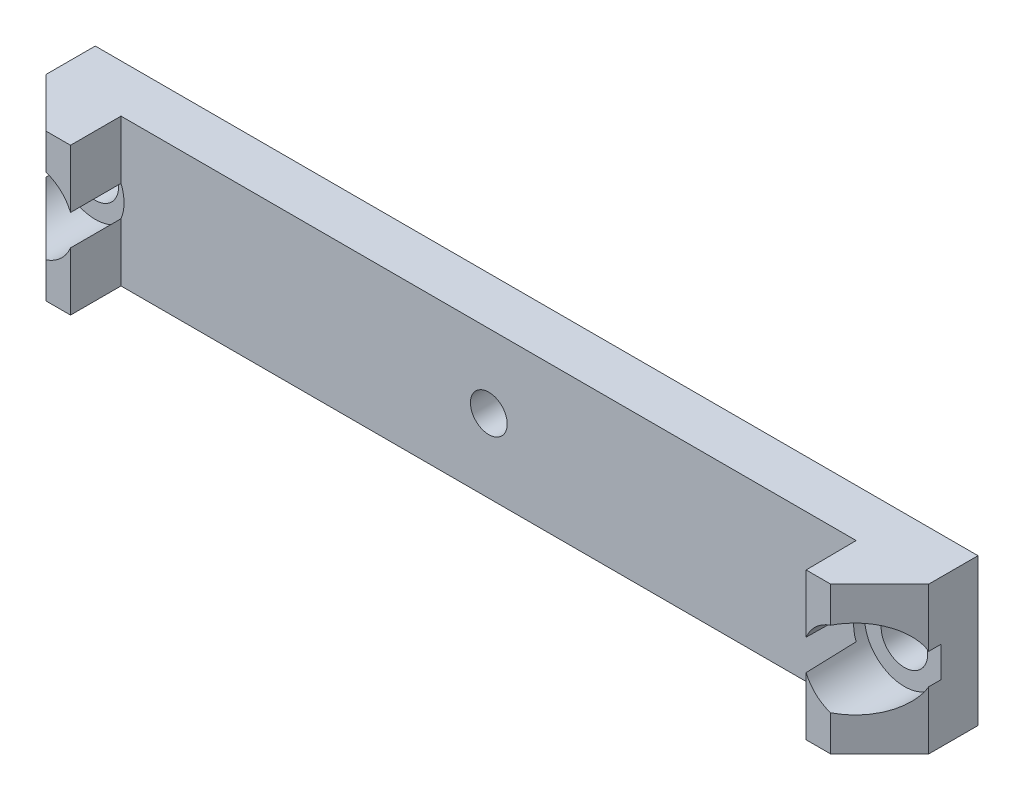
ISO-10303-21;
HEADER;
FILE_DESCRIPTION(('STEP AP214'),'2;1');
FILE_NAME('part.step','',(''),(''),'','','');
FILE_SCHEMA(('AUTOMOTIVE_DESIGN { 1 0 10303 214 1 1 1 1 }'));
ENDSEC;
DATA;
#1=APPLICATION_CONTEXT('core data for automotive mechanical design processes');
#2=APPLICATION_PROTOCOL_DEFINITION('international standard','automotive_design',2000,#1);
#3=PRODUCT_CONTEXT('',#1,'mechanical');
#4=PRODUCT('Part','Part','',(#3));
#5=PRODUCT_RELATED_PRODUCT_CATEGORY('part','',(#4));
#6=PRODUCT_DEFINITION_FORMATION('','',#4);
#7=PRODUCT_DEFINITION_CONTEXT('part definition',#1,'design');
#8=PRODUCT_DEFINITION('design','',#6,#7);
#9=PRODUCT_DEFINITION_SHAPE('','',#8);
#10=(LENGTH_UNIT() NAMED_UNIT(*) SI_UNIT(.MILLI.,.METRE.));
#11=(NAMED_UNIT(*) PLANE_ANGLE_UNIT() SI_UNIT($,.RADIAN.));
#12=(NAMED_UNIT(*) SI_UNIT($,.STERADIAN.) SOLID_ANGLE_UNIT());
#13=UNCERTAINTY_MEASURE_WITH_UNIT(LENGTH_MEASURE(1.E-05),#10,'distance_accuracy_value','');
#14=(GEOMETRIC_REPRESENTATION_CONTEXT(3) GLOBAL_UNCERTAINTY_ASSIGNED_CONTEXT((#13)) GLOBAL_UNIT_ASSIGNED_CONTEXT((#10,
#11,#12)) REPRESENTATION_CONTEXT('',''));
#15=CARTESIAN_POINT('',(0.,0.,0.));
#16=DIRECTION('',(0.,0.,1.));
#17=DIRECTION('',(1.,0.,0.));
#18=AXIS2_PLACEMENT_3D('',#15,#16,#17);
#19=CARTESIAN_POINT('',(-33.,0.,-9.19238815542512));
#20=DIRECTION('',(0.,0.,1.));
#21=DIRECTION('',(1.,0.,0.));
#22=AXIS2_PLACEMENT_3D('',#19,#20,#21);
#23=CYLINDRICAL_SURFACE('',#22,3.25);
#24=DIRECTION('',(0.,0.,-1.));
#25=VECTOR('',#24,1.);
#26=CARTESIAN_POINT('',(-30.,-1.25,4.2));
#27=LINE('',#26,#25);
#28=CARTESIAN_POINT('',(-30.,-1.25,3.9));
#29=VERTEX_POINT('',#28);
#30=CARTESIAN_POINT('',(-30.,-1.25,8.01789608293694));
#31=VERTEX_POINT('',#30);
#32=EDGE_CURVE('E203',#29,#31,#27,.F.);
#33=ORIENTED_EDGE('',*,*,#32,.F.);
#34=CARTESIAN_POINT('',(-33.,0.,3.9));
#35=DIRECTION('',(0.,0.,-1.));
#36=DIRECTION('',(-1.,0.,0.));
#37=AXIS2_PLACEMENT_3D('',#34,#35,#36);
#38=CIRCLE('',#37,3.25);
#39=CARTESIAN_POINT('',(-30.,1.25,3.9));
#40=VERTEX_POINT('',#39);
#41=EDGE_CURVE('E429',#29,#40,#38,.F.);
#42=ORIENTED_EDGE('',*,*,#41,.T.);
#43=DIRECTION('',(0.,0.,-1.));
#44=VECTOR('',#43,1.);
#45=CARTESIAN_POINT('',(-30.,1.25,4.2));
#46=LINE('',#45,#44);
#47=CARTESIAN_POINT('',(-30.,1.25,8.01789608293694));
#48=VERTEX_POINT('',#47);
#49=EDGE_CURVE('E212',#48,#40,#46,.T.);
#50=ORIENTED_EDGE('',*,*,#49,.F.);
#51=CARTESIAN_POINT('',(-33.,0.,8.01789608293694));
#52=DIRECTION('',(0.,0.,1.));
#53=DIRECTION('',(1.,0.,0.));
#54=AXIS2_PLACEMENT_3D('',#51,#52,#53);
#55=CIRCLE('',#54,3.25);
#56=CARTESIAN_POINT('',(-32.,3.09232921921324,8.01789608293694));
#57=VERTEX_POINT('',#56);
#58=EDGE_CURVE('E211',#57,#48,#55,.F.);
#59=ORIENTED_EDGE('',*,*,#58,.F.);
#60=CARTESIAN_POINT('',(-33.,0.,7.01789608293693));
#61=DIRECTION('',(-0.707106781186548,0.,0.707106781186547));
#62=DIRECTION('',(0.707106781186547,0.,0.707106781186548));
#63=AXIS2_PLACEMENT_3D('',#60,#61,#62);
#64=ELLIPSE('',#63,4.59619407771256,3.25);
#65=CARTESIAN_POINT('',(-36.,1.24999999999999,4.01789608293693));
#66=VERTEX_POINT('',#65);
#67=EDGE_CURVE('E208',#66,#57,#64,.F.);
#68=ORIENTED_EDGE('',*,*,#67,.F.);
#69=DIRECTION('',(0.,0.,1.));
#70=VECTOR('',#69,1.);
#71=CARTESIAN_POINT('',(-36.,1.24999999999999,-9.19238815542512));
#72=LINE('',#71,#70);
#73=CARTESIAN_POINT('',(-36.,1.24999999999999,3.));
#74=VERTEX_POINT('',#73);
#75=EDGE_CURVE('E336',#74,#66,#72,.T.);
#76=ORIENTED_EDGE('',*,*,#75,.F.);
#77=CARTESIAN_POINT('',(-33.,0.,3.));
#78=DIRECTION('',(0.,0.,1.));
#79=DIRECTION('',(1.,0.,0.));
#80=AXIS2_PLACEMENT_3D('',#77,#78,#79);
#81=CIRCLE('',#80,3.25);
#82=CARTESIAN_POINT('',(-36.,-1.24999999999999,3.));
#83=VERTEX_POINT('',#82);
#84=EDGE_CURVE('E204',#83,#74,#81,.T.);
#85=ORIENTED_EDGE('',*,*,#84,.F.);
#86=DIRECTION('',(0.,0.,1.));
#87=VECTOR('',#86,1.);
#88=CARTESIAN_POINT('',(-36.,-1.24999999999999,-9.19238815542512));
#89=LINE('',#88,#87);
#90=CARTESIAN_POINT('',(-36.,-1.24999999999999,4.01789608293693));
#91=VERTEX_POINT('',#90);
#92=EDGE_CURVE('E333',#91,#83,#89,.F.);
#93=ORIENTED_EDGE('',*,*,#92,.F.);
#94=CARTESIAN_POINT('',(-33.,0.,7.01789608293693));
#95=DIRECTION('',(-0.707106781186548,0.,0.707106781186547));
#96=DIRECTION('',(0.707106781186547,0.,0.707106781186548));
#97=AXIS2_PLACEMENT_3D('',#94,#95,#96);
#98=ELLIPSE('',#97,4.59619407771256,3.25);
#99=CARTESIAN_POINT('',(-32.,-3.09232921921324,8.01789608293694));
#100=VERTEX_POINT('',#99);
#101=EDGE_CURVE('E190',#100,#91,#98,.F.);
#102=ORIENTED_EDGE('',*,*,#101,.F.);
#103=CARTESIAN_POINT('',(-33.,0.,8.01789608293694));
#104=DIRECTION('',(0.,0.,1.));
#105=DIRECTION('',(1.,0.,0.));
#106=AXIS2_PLACEMENT_3D('',#103,#104,#105);
#107=CIRCLE('',#106,3.25);
#108=EDGE_CURVE('E201',#31,#100,#107,.F.);
#109=ORIENTED_EDGE('',*,*,#108,.F.);
#110=EDGE_LOOP('',(#33,#42,#50,#59,#68,#76,#85,#93,#102,#109));
#111=FACE_BOUND('',#110,.T.);
#112=ADVANCED_FACE('F42',(#111),#23,.F.);
#113=CARTESIAN_POINT('',(33.,0.,-9.19238815542512));
#114=DIRECTION('',(0.,0.,1.));
#115=DIRECTION('',(1.,0.,0.));
#116=AXIS2_PLACEMENT_3D('',#113,#114,#115);
#117=CYLINDRICAL_SURFACE('',#116,3.25);
#118=CARTESIAN_POINT('',(29.9636318165585,1.15886507177674,4.2));
#119=CARTESIAN_POINT('',(29.9811279470011,1.20470707280253,6.03672654397552));
#120=CARTESIAN_POINT('',(30.,1.25000000000003,8.01789608293694));
#121=B_SPLINE_CURVE_WITH_KNOTS('',2,(#118,#119,#120),.UNSPECIFIED.,.F.,.F.,(3,3),(0.,1.),.UNSPECIFIED.);
#122=CARTESIAN_POINT('',(29.9636318165585,1.15886507177675,4.2));
#123=VERTEX_POINT('',#122);
#124=CARTESIAN_POINT('',(30.,1.25000000000004,8.01789608293694));
#125=VERTEX_POINT('',#124);
#126=EDGE_CURVE('E171',#123,#125,#121,.T.);
#127=ORIENTED_EDGE('',*,*,#126,.F.);
#128=DIRECTION('',(0.,0.,1.));
#129=VECTOR('',#128,1.);
#130=CARTESIAN_POINT('',(29.9636318165585,1.15886507177675,-9.19238815542512));
#131=LINE('',#130,#129);
#132=CARTESIAN_POINT('',(29.9636318165585,1.15886507177675,3.9));
#133=VERTEX_POINT('',#132);
#134=EDGE_CURVE('E342',#123,#133,#131,.F.);
#135=ORIENTED_EDGE('',*,*,#134,.T.);
#136=CARTESIAN_POINT('',(33.,0.,3.9));
#137=DIRECTION('',(0.,0.,-1.));
#138=DIRECTION('',(-1.,0.,0.));
#139=AXIS2_PLACEMENT_3D('',#136,#137,#138);
#140=CIRCLE('',#139,3.25);
#141=CARTESIAN_POINT('',(29.9636318165585,-1.15886507177675,3.9));
#142=VERTEX_POINT('',#141);
#143=EDGE_CURVE('E434',#133,#142,#140,.F.);
#144=ORIENTED_EDGE('',*,*,#143,.T.);
#145=DIRECTION('',(0.,0.,1.));
#146=VECTOR('',#145,1.);
#147=CARTESIAN_POINT('',(29.9636318165585,-1.15886507177675,-9.19238815542512));
#148=LINE('',#147,#146);
#149=CARTESIAN_POINT('',(29.9636318165585,-1.15886507177674,4.19999999999964));
#150=VERTEX_POINT('',#149);
#151=EDGE_CURVE('E428',#142,#150,#148,.T.);
#152=ORIENTED_EDGE('',*,*,#151,.T.);
#153=CARTESIAN_POINT('',(30.,-1.25000000000003,8.01789608293694));
#154=CARTESIAN_POINT('',(29.9811279470011,-1.20470707280254,6.03672654397578));
#155=CARTESIAN_POINT('',(29.9636318165585,-1.15886507177674,4.2));
#156=B_SPLINE_CURVE_WITH_KNOTS('',2,(#153,#154,#155),.UNSPECIFIED.,.F.,.F.,(3,3),(0.,1.),.UNSPECIFIED.);
#157=CARTESIAN_POINT('',(30.,-1.25000000000004,8.01789608293694));
#158=VERTEX_POINT('',#157);
#159=EDGE_CURVE('E265',#158,#150,#156,.T.);
#160=ORIENTED_EDGE('',*,*,#159,.F.);
#161=CARTESIAN_POINT('',(33.,0.,8.01789608293694));
#162=DIRECTION('',(0.,0.,1.));
#163=DIRECTION('',(1.,0.,0.));
#164=AXIS2_PLACEMENT_3D('',#161,#162,#163);
#165=CIRCLE('',#164,3.25);
#166=CARTESIAN_POINT('',(32.,-3.09232921921325,8.01789608293694));
#167=VERTEX_POINT('',#166);
#168=EDGE_CURVE('E198',#167,#158,#165,.F.);
#169=ORIENTED_EDGE('',*,*,#168,.F.);
#170=CARTESIAN_POINT('',(33.,0.,7.01789608293695));
#171=DIRECTION('',(0.707106781186545,0.,0.70710678118655));
#172=DIRECTION('',(-0.70710678118655,0.,0.707106781186545));
#173=AXIS2_PLACEMENT_3D('',#170,#171,#172);
#174=ELLIPSE('',#173,4.59619407771255,3.25);
#175=CARTESIAN_POINT('',(36.,-1.24999999999999,4.01789608293696));
#176=VERTEX_POINT('',#175);
#177=EDGE_CURVE('E182',#176,#167,#174,.F.);
#178=ORIENTED_EDGE('',*,*,#177,.F.);
#179=DIRECTION('',(0.,0.,1.));
#180=VECTOR('',#179,1.);
#181=CARTESIAN_POINT('',(36.,-1.24999999999999,-9.19238815542512));
#182=LINE('',#181,#180);
#183=CARTESIAN_POINT('',(36.,-1.24999999999999,3.));
#184=VERTEX_POINT('',#183);
#185=EDGE_CURVE('E172',#184,#176,#182,.T.);
#186=ORIENTED_EDGE('',*,*,#185,.F.);
#187=CARTESIAN_POINT('',(33.,0.,3.));
#188=DIRECTION('',(0.,0.,1.));
#189=DIRECTION('',(1.,0.,0.));
#190=AXIS2_PLACEMENT_3D('',#187,#188,#189);
#191=CIRCLE('',#190,3.25);
#192=CARTESIAN_POINT('',(36.,1.24999999999999,3.));
#193=VERTEX_POINT('',#192);
#194=EDGE_CURVE('E358',#193,#184,#191,.T.);
#195=ORIENTED_EDGE('',*,*,#194,.F.);
#196=DIRECTION('',(0.,0.,1.));
#197=VECTOR('',#196,1.);
#198=CARTESIAN_POINT('',(36.,1.24999999999999,-9.19238815542512));
#199=LINE('',#198,#197);
#200=CARTESIAN_POINT('',(36.,1.24999999999999,4.01789608293696));
#201=VERTEX_POINT('',#200);
#202=EDGE_CURVE('E186',#201,#193,#199,.F.);
#203=ORIENTED_EDGE('',*,*,#202,.F.);
#204=CARTESIAN_POINT('',(33.,0.,7.01789608293695));
#205=DIRECTION('',(0.707106781186545,0.,0.70710678118655));
#206=DIRECTION('',(-0.70710678118655,0.,0.707106781186545));
#207=AXIS2_PLACEMENT_3D('',#204,#205,#206);
#208=ELLIPSE('',#207,4.59619407771255,3.25);
#209=CARTESIAN_POINT('',(32.,3.09232921921325,8.01789608293694));
#210=VERTEX_POINT('',#209);
#211=EDGE_CURVE('E179',#210,#201,#208,.F.);
#212=ORIENTED_EDGE('',*,*,#211,.F.);
#213=CARTESIAN_POINT('',(33.,0.,8.01789608293694));
#214=DIRECTION('',(0.,0.,1.));
#215=DIRECTION('',(1.,0.,0.));
#216=AXIS2_PLACEMENT_3D('',#213,#214,#215);
#217=CIRCLE('',#216,3.25);
#218=EDGE_CURVE('E161',#125,#210,#217,.F.);
#219=ORIENTED_EDGE('',*,*,#218,.F.);
#220=EDGE_LOOP('',(#127,#135,#144,#152,#160,#169,#178,#186,#195,#203,#212,#219));
#221=FACE_BOUND('',#220,.T.);
#222=ADVANCED_FACE('F184',(#221),#117,.F.);
#223=CARTESIAN_POINT('',(30.,12.9891874063228,8.01789608293694));
#224=DIRECTION('',(0.,0.,1.));
#225=DIRECTION('',(1.,0.,0.));
#226=AXIS2_PLACEMENT_3D('',#223,#224,#225);
#227=PLANE('',#226);
#228=DIRECTION('',(1.,0.,0.));
#229=VECTOR('',#228,1.);
#230=CARTESIAN_POINT('',(-36.,6.,8.01789608293694));
#231=LINE('',#230,#229);
#232=CARTESIAN_POINT('',(32.,6.,8.01789608293694));
#233=VERTEX_POINT('',#232);
#234=CARTESIAN_POINT('',(30.,6.,8.01789608293694));
#235=VERTEX_POINT('',#234);
#236=EDGE_CURVE('E245',#233,#235,#231,.F.);
#237=ORIENTED_EDGE('',*,*,#236,.T.);
#238=DIRECTION('',(0.,1.,0.));
#239=VECTOR('',#238,1.);
#240=CARTESIAN_POINT('',(30.,12.9891874063228,8.01789608293694));
#241=LINE('',#240,#239);
#242=EDGE_CURVE('E167',#125,#235,#241,.T.);
#243=ORIENTED_EDGE('',*,*,#242,.F.);
#244=ORIENTED_EDGE('',*,*,#218,.T.);
#245=DIRECTION('',(0.,1.,0.));
#246=VECTOR('',#245,1.);
#247=CARTESIAN_POINT('',(32.,12.9891874063228,8.01789608293694));
#248=LINE('',#247,#246);
#249=EDGE_CURVE('E165',#233,#210,#248,.F.);
#250=ORIENTED_EDGE('',*,*,#249,.F.);
#251=EDGE_LOOP('',(#237,#243,#244,#250));
#252=FACE_BOUND('',#251,.T.);
#253=ADVANCED_FACE('F164',(#252),#227,.T.);
#254=CARTESIAN_POINT('',(29.9636318165585,12.9891874063228,4.2));
#255=DIRECTION('',(-0.999954633480566,0.,0.00952528113747001));
#256=DIRECTION('',(0.00952528113747001,0.,0.999954633480566));
#257=AXIS2_PLACEMENT_3D('',#254,#255,#256);
#258=PLANE('',#257);
#259=DIRECTION('',(-0.00952528113747001,0.,-0.999954633480565));
#260=VECTOR('',#259,1.);
#261=CARTESIAN_POINT('',(30.,6.,8.01789608293694));
#262=LINE('',#261,#260);
#263=CARTESIAN_POINT('',(29.9636318165585,6.,4.2));
#264=VERTEX_POINT('',#263);
#265=EDGE_CURVE('E328',#235,#264,#262,.T.);
#266=ORIENTED_EDGE('',*,*,#265,.T.);
#267=DIRECTION('',(0.,1.,0.));
#268=VECTOR('',#267,1.);
#269=CARTESIAN_POINT('',(29.9636318165585,0.,4.2));
#270=LINE('',#269,#268);
#271=EDGE_CURVE('E270',#123,#264,#270,.T.);
#272=ORIENTED_EDGE('',*,*,#271,.F.);
#273=ORIENTED_EDGE('',*,*,#126,.T.);
#274=ORIENTED_EDGE('',*,*,#242,.T.);
#275=EDGE_LOOP('',(#266,#272,#273,#274));
#276=FACE_BOUND('',#275,.T.);
#277=ADVANCED_FACE('F307',(#276),#258,.T.);
#278=CARTESIAN_POINT('',(-30.,12.9891874063228,4.2));
#279=DIRECTION('',(1.,0.,0.));
#280=DIRECTION('',(0.,0.,-1.));
#281=AXIS2_PLACEMENT_3D('',#278,#279,#280);
#282=PLANE('',#281);
#283=DIRECTION('',(0.,0.,-1.));
#284=VECTOR('',#283,1.);
#285=CARTESIAN_POINT('',(-30.,6.,4.2));
#286=LINE('',#285,#284);
#287=CARTESIAN_POINT('',(-30.,6.,3.9));
#288=VERTEX_POINT('',#287);
#289=CARTESIAN_POINT('',(-30.,6.,8.01789608293694));
#290=VERTEX_POINT('',#289);
#291=EDGE_CURVE('E398',#288,#290,#286,.F.);
#292=ORIENTED_EDGE('',*,*,#291,.T.);
#293=DIRECTION('',(0.,1.,0.));
#294=VECTOR('',#293,1.);
#295=CARTESIAN_POINT('',(-30.,12.9891874063228,8.01789608293694));
#296=LINE('',#295,#294);
#297=EDGE_CURVE('E210',#48,#290,#296,.T.);
#298=ORIENTED_EDGE('',*,*,#297,.F.);
#299=ORIENTED_EDGE('',*,*,#49,.T.);
#300=DIRECTION('',(0.,-1.,0.));
#301=VECTOR('',#300,1.);
#302=CARTESIAN_POINT('',(-30.,6.00010307764066,3.9));
#303=LINE('',#302,#301);
#304=EDGE_CURVE('E474',#288,#40,#303,.T.);
#305=ORIENTED_EDGE('',*,*,#304,.F.);
#306=EDGE_LOOP('',(#292,#298,#299,#305));
#307=FACE_BOUND('',#306,.T.);
#308=ADVANCED_FACE('F303',(#307),#282,.T.);
#309=CARTESIAN_POINT('',(-30.,12.9891874063228,8.01789608293694));
#310=DIRECTION('',(0.,0.,1.));
#311=DIRECTION('',(1.,0.,0.));
#312=AXIS2_PLACEMENT_3D('',#309,#310,#311);
#313=PLANE('',#312);
#314=DIRECTION('',(1.,0.,0.));
#315=VECTOR('',#314,1.);
#316=CARTESIAN_POINT('',(-36.,6.,8.01789608293694));
#317=LINE('',#316,#315);
#318=CARTESIAN_POINT('',(-32.,6.,8.01789608293694));
#319=VERTEX_POINT('',#318);
#320=EDGE_CURVE('E394',#290,#319,#317,.F.);
#321=ORIENTED_EDGE('',*,*,#320,.T.);
#322=DIRECTION('',(0.,1.,0.));
#323=VECTOR('',#322,1.);
#324=CARTESIAN_POINT('',(-32.,12.9891874063228,8.01789608293694));
#325=LINE('',#324,#323);
#326=EDGE_CURVE('E207',#57,#319,#325,.T.);
#327=ORIENTED_EDGE('',*,*,#326,.F.);
#328=ORIENTED_EDGE('',*,*,#58,.T.);
#329=ORIENTED_EDGE('',*,*,#297,.T.);
#330=EDGE_LOOP('',(#321,#327,#328,#329));
#331=FACE_BOUND('',#330,.T.);
#332=ADVANCED_FACE('F299',(#331),#313,.T.);
#333=CARTESIAN_POINT('',(-32.,12.9891874063228,8.01789608293694));
#334=DIRECTION('',(-0.707106781186548,0.,0.707106781186547));
#335=DIRECTION('',(0.707106781186547,0.,0.707106781186548));
#336=AXIS2_PLACEMENT_3D('',#333,#334,#335);
#337=PLANE('',#336);
#338=DIRECTION('',(-0.707106781186547,0.,-0.707106781186548));
#339=VECTOR('',#338,1.);
#340=CARTESIAN_POINT('',(-32.,6.,8.01789608293694));
#341=LINE('',#340,#339);
#342=CARTESIAN_POINT('',(-36.,6.,4.01789608293692));
#343=VERTEX_POINT('',#342);
#344=EDGE_CURVE('E397',#319,#343,#341,.T.);
#345=ORIENTED_EDGE('',*,*,#344,.T.);
#346=DIRECTION('',(0.,1.,0.));
#347=VECTOR('',#346,1.);
#348=CARTESIAN_POINT('',(-36.,6.,4.01789608293692));
#349=LINE('',#348,#347);
#350=EDGE_CURVE('E554',#343,#66,#349,.F.);
#351=ORIENTED_EDGE('',*,*,#350,.T.);
#352=ORIENTED_EDGE('',*,*,#67,.T.);
#353=ORIENTED_EDGE('',*,*,#326,.T.);
#354=EDGE_LOOP('',(#345,#351,#352,#353));
#355=FACE_BOUND('',#354,.T.);
#356=ADVANCED_FACE('F295',(#355),#337,.T.);
#357=CARTESIAN_POINT('',(0.,0.,3.));
#358=DIRECTION('',(0.,0.,1.));
#359=DIRECTION('',(1.,0.,0.));
#360=AXIS2_PLACEMENT_3D('',#357,#358,#359);
#361=PLANE('',#360);
#362=DIRECTION('',(0.,1.,0.));
#363=VECTOR('',#362,1.);
#364=CARTESIAN_POINT('',(-36.,6.,3.));
#365=LINE('',#364,#363);
#366=EDGE_CURVE('E544',#74,#83,#365,.F.);
#367=ORIENTED_EDGE('',*,*,#366,.T.);
#368=ORIENTED_EDGE('',*,*,#84,.T.);
#369=EDGE_LOOP('',(#367,#368));
#370=FACE_BOUND('',#369,.T.);
#371=CARTESIAN_POINT('',(-33.,0.,3.));
#372=DIRECTION('',(0.,0.,1.));
#373=DIRECTION('',(1.,0.,0.));
#374=AXIS2_PLACEMENT_3D('',#371,#372,#373);
#375=CIRCLE('',#374,1.9);
#376=CARTESIAN_POINT('',(-31.1,0.,3.));
#377=VERTEX_POINT('',#376);
#378=EDGE_CURVE('E356',#377,#377,#375,.F.);
#379=ORIENTED_EDGE('',*,*,#378,.T.);
#380=EDGE_LOOP('',(#379));
#381=FACE_BOUND('',#380,.T.);
#382=ADVANCED_FACE('F291',(#370,#381),#361,.T.);
#383=CARTESIAN_POINT('',(-30.,12.9891874063228,8.01789608293694));
#384=DIRECTION('',(0.,0.,1.));
#385=DIRECTION('',(1.,0.,0.));
#386=AXIS2_PLACEMENT_3D('',#383,#384,#385);
#387=PLANE('',#386);
#388=DIRECTION('',(1.,0.,0.));
#389=VECTOR('',#388,1.);
#390=CARTESIAN_POINT('',(-36.,-6.,8.01789608293694));
#391=LINE('',#390,#389);
#392=CARTESIAN_POINT('',(-32.,-6.,8.01789608293694));
#393=VERTEX_POINT('',#392);
#394=CARTESIAN_POINT('',(-30.,-6.,8.01789608293694));
#395=VERTEX_POINT('',#394);
#396=EDGE_CURVE('E542',#393,#395,#391,.T.);
#397=ORIENTED_EDGE('',*,*,#396,.T.);
#398=DIRECTION('',(0.,1.,0.));
#399=VECTOR('',#398,1.);
#400=CARTESIAN_POINT('',(-30.,12.9891874063228,8.01789608293694));
#401=LINE('',#400,#399);
#402=EDGE_CURVE('E340',#31,#395,#401,.F.);
#403=ORIENTED_EDGE('',*,*,#402,.F.);
#404=ORIENTED_EDGE('',*,*,#108,.T.);
#405=DIRECTION('',(0.,1.,0.));
#406=VECTOR('',#405,1.);
#407=CARTESIAN_POINT('',(-32.,12.9891874063228,8.01789608293694));
#408=LINE('',#407,#406);
#409=EDGE_CURVE('E187',#393,#100,#408,.T.);
#410=ORIENTED_EDGE('',*,*,#409,.F.);
#411=EDGE_LOOP('',(#397,#403,#404,#410));
#412=FACE_BOUND('',#411,.T.);
#413=ADVANCED_FACE('F288',(#412),#387,.T.);
#414=CARTESIAN_POINT('',(-30.,12.9891874063228,4.2));
#415=DIRECTION('',(1.,0.,0.));
#416=DIRECTION('',(0.,0.,-1.));
#417=AXIS2_PLACEMENT_3D('',#414,#415,#416);
#418=PLANE('',#417);
#419=DIRECTION('',(0.,0.,1.));
#420=VECTOR('',#419,1.);
#421=CARTESIAN_POINT('',(-30.,-6.,4.2));
#422=LINE('',#421,#420);
#423=CARTESIAN_POINT('',(-30.,-6.,3.9));
#424=VERTEX_POINT('',#423);
#425=EDGE_CURVE('E57',#395,#424,#422,.F.);
#426=ORIENTED_EDGE('',*,*,#425,.T.);
#427=EDGE_CURVE('E477',#29,#424,#303,.T.);
#428=ORIENTED_EDGE('',*,*,#427,.F.);
#429=ORIENTED_EDGE('',*,*,#32,.T.);
#430=ORIENTED_EDGE('',*,*,#402,.T.);
#431=EDGE_LOOP('',(#426,#428,#429,#430));
#432=FACE_BOUND('',#431,.T.);
#433=ADVANCED_FACE('F283',(#432),#418,.T.);
#434=CARTESIAN_POINT('',(29.9636318165585,12.9891874063228,4.2));
#435=DIRECTION('',(-0.999954633480566,0.,0.00952528113747001));
#436=DIRECTION('',(0.00952528113747001,0.,0.999954633480566));
#437=AXIS2_PLACEMENT_3D('',#434,#435,#436);
#438=PLANE('',#437);
#439=DIRECTION('',(0.00952528113747001,0.,0.999954633480565));
#440=VECTOR('',#439,1.);
#441=CARTESIAN_POINT('',(29.9636318165585,-6.,4.2));
#442=LINE('',#441,#440);
#443=CARTESIAN_POINT('',(29.9636318165585,-6.,4.2));
#444=VERTEX_POINT('',#443);
#445=CARTESIAN_POINT('',(30.,-6.,8.01789608293694));
#446=VERTEX_POINT('',#445);
#447=EDGE_CURVE('E255',#444,#446,#442,.T.);
#448=ORIENTED_EDGE('',*,*,#447,.T.);
#449=DIRECTION('',(0.,1.,0.));
#450=VECTOR('',#449,1.);
#451=CARTESIAN_POINT('',(30.,12.9891874063228,8.01789608293694));
#452=LINE('',#451,#450);
#453=EDGE_CURVE('E197',#158,#446,#452,.F.);
#454=ORIENTED_EDGE('',*,*,#453,.F.);
#455=ORIENTED_EDGE('',*,*,#159,.T.);
#456=DIRECTION('',(0.,1.,0.));
#457=VECTOR('',#456,1.);
#458=CARTESIAN_POINT('',(29.9636318165585,12.9891874063228,4.2));
#459=LINE('',#458,#457);
#460=EDGE_CURVE('E200',#150,#444,#459,.F.);
#461=ORIENTED_EDGE('',*,*,#460,.T.);
#462=EDGE_LOOP('',(#448,#454,#455,#461));
#463=FACE_BOUND('',#462,.T.);
#464=ADVANCED_FACE('F272',(#463),#438,.T.);
#465=CARTESIAN_POINT('',(30.,12.9891874063228,8.01789608293694));
#466=DIRECTION('',(0.,0.,1.));
#467=DIRECTION('',(1.,0.,0.));
#468=AXIS2_PLACEMENT_3D('',#465,#466,#467);
#469=PLANE('',#468);
#470=DIRECTION('',(1.,0.,0.));
#471=VECTOR('',#470,1.);
#472=CARTESIAN_POINT('',(-36.,-6.,8.01789608293694));
#473=LINE('',#472,#471);
#474=CARTESIAN_POINT('',(32.,-6.,8.01789608293695));
#475=VERTEX_POINT('',#474);
#476=EDGE_CURVE('E251',#446,#475,#473,.T.);
#477=ORIENTED_EDGE('',*,*,#476,.T.);
#478=DIRECTION('',(0.,1.,0.));
#479=VECTOR('',#478,1.);
#480=CARTESIAN_POINT('',(32.,12.9891874063228,8.01789608293694));
#481=LINE('',#480,#479);
#482=EDGE_CURVE('E360',#167,#475,#481,.F.);
#483=ORIENTED_EDGE('',*,*,#482,.F.);
#484=ORIENTED_EDGE('',*,*,#168,.T.);
#485=ORIENTED_EDGE('',*,*,#453,.T.);
#486=EDGE_LOOP('',(#477,#483,#484,#485));
#487=FACE_BOUND('',#486,.T.);
#488=ADVANCED_FACE('F282',(#487),#469,.T.);
#489=CARTESIAN_POINT('',(-32.,12.9891874063228,8.01789608293694));
#490=DIRECTION('',(-0.707106781186548,0.,0.707106781186547));
#491=DIRECTION('',(0.707106781186547,0.,0.707106781186548));
#492=AXIS2_PLACEMENT_3D('',#489,#490,#491);
#493=PLANE('',#492);
#494=DIRECTION('',(0.707106781186547,0.,0.707106781186548));
#495=VECTOR('',#494,1.);
#496=CARTESIAN_POINT('',(-36.,-6.,4.01789608293692));
#497=LINE('',#496,#495);
#498=CARTESIAN_POINT('',(-36.,-6.,4.01789608293692));
#499=VERTEX_POINT('',#498);
#500=EDGE_CURVE('E237',#499,#393,#497,.T.);
#501=ORIENTED_EDGE('',*,*,#500,.T.);
#502=ORIENTED_EDGE('',*,*,#409,.T.);
#503=ORIENTED_EDGE('',*,*,#101,.T.);
#504=DIRECTION('',(0.,1.,0.));
#505=VECTOR('',#504,1.);
#506=CARTESIAN_POINT('',(-36.,6.,4.01789608293692));
#507=LINE('',#506,#505);
#508=EDGE_CURVE('E540',#91,#499,#507,.F.);
#509=ORIENTED_EDGE('',*,*,#508,.T.);
#510=EDGE_LOOP('',(#501,#502,#503,#509));
#511=FACE_BOUND('',#510,.T.);
#512=ADVANCED_FACE('F531',(#511),#493,.T.);
#513=CARTESIAN_POINT('',(32.,12.9891874063228,8.01789608293694));
#514=DIRECTION('',(0.707106781186545,0.,0.70710678118655));
#515=DIRECTION('',(0.70710678118655,0.,-0.707106781186545));
#516=AXIS2_PLACEMENT_3D('',#513,#514,#515);
#517=PLANE('',#516);
#518=DIRECTION('',(-0.707106781186551,0.,0.707106781186544));
#519=VECTOR('',#518,1.);
#520=CARTESIAN_POINT('',(36.,6.,4.01789608293696));
#521=LINE('',#520,#519);
#522=CARTESIAN_POINT('',(36.,6.,4.01789608293696));
#523=VERTEX_POINT('',#522);
#524=EDGE_CURVE('E181',#523,#233,#521,.T.);
#525=ORIENTED_EDGE('',*,*,#524,.T.);
#526=ORIENTED_EDGE('',*,*,#249,.T.);
#527=ORIENTED_EDGE('',*,*,#211,.T.);
#528=DIRECTION('',(0.,1.,0.));
#529=VECTOR('',#528,1.);
#530=CARTESIAN_POINT('',(36.,6.,4.01789608293696));
#531=LINE('',#530,#529);
#532=EDGE_CURVE('E234',#201,#523,#531,.T.);
#533=ORIENTED_EDGE('',*,*,#532,.T.);
#534=EDGE_LOOP('',(#525,#526,#527,#533));
#535=FACE_BOUND('',#534,.T.);
#536=ADVANCED_FACE('F177',(#535),#517,.T.);
#537=CARTESIAN_POINT('',(32.,12.9891874063228,8.01789608293694));
#538=DIRECTION('',(0.707106781186545,0.,0.70710678118655));
#539=DIRECTION('',(0.70710678118655,0.,-0.707106781186545));
#540=AXIS2_PLACEMENT_3D('',#537,#538,#539);
#541=PLANE('',#540);
#542=DIRECTION('',(0.707106781186551,0.,-0.707106781186544));
#543=VECTOR('',#542,1.);
#544=CARTESIAN_POINT('',(32.,-6.,8.01789608293694));
#545=LINE('',#544,#543);
#546=CARTESIAN_POINT('',(36.,-6.,4.01789608293696));
#547=VERTEX_POINT('',#546);
#548=EDGE_CURVE('E254',#475,#547,#545,.T.);
#549=ORIENTED_EDGE('',*,*,#548,.T.);
#550=DIRECTION('',(0.,1.,0.));
#551=VECTOR('',#550,1.);
#552=CARTESIAN_POINT('',(36.,6.,4.01789608293696));
#553=LINE('',#552,#551);
#554=EDGE_CURVE('E373',#547,#176,#553,.T.);
#555=ORIENTED_EDGE('',*,*,#554,.T.);
#556=ORIENTED_EDGE('',*,*,#177,.T.);
#557=ORIENTED_EDGE('',*,*,#482,.T.);
#558=EDGE_LOOP('',(#549,#555,#556,#557));
#559=FACE_BOUND('',#558,.T.);
#560=ADVANCED_FACE('F527',(#559),#541,.T.);
#561=CARTESIAN_POINT('',(0.,0.,3.));
#562=DIRECTION('',(0.,0.,1.));
#563=DIRECTION('',(1.,0.,0.));
#564=AXIS2_PLACEMENT_3D('',#561,#562,#563);
#565=PLANE('',#564);
#566=DIRECTION('',(0.,1.,0.));
#567=VECTOR('',#566,1.);
#568=CARTESIAN_POINT('',(36.,6.,3.));
#569=LINE('',#568,#567);
#570=EDGE_CURVE('E353',#184,#193,#569,.T.);
#571=ORIENTED_EDGE('',*,*,#570,.T.);
#572=ORIENTED_EDGE('',*,*,#194,.T.);
#573=EDGE_LOOP('',(#571,#572));
#574=FACE_BOUND('',#573,.T.);
#575=CARTESIAN_POINT('',(33.,0.,3.));
#576=DIRECTION('',(0.,0.,1.));
#577=DIRECTION('',(1.,0.,0.));
#578=AXIS2_PLACEMENT_3D('',#575,#576,#577);
#579=CIRCLE('',#578,1.9);
#580=CARTESIAN_POINT('',(34.9,0.,3.));
#581=VERTEX_POINT('',#580);
#582=EDGE_CURVE('E246',#581,#581,#579,.F.);
#583=ORIENTED_EDGE('',*,*,#582,.T.);
#584=EDGE_LOOP('',(#583));
#585=FACE_BOUND('',#584,.T.);
#586=ADVANCED_FACE('F524',(#574,#585),#565,.T.);
#587=CARTESIAN_POINT('',(0.,0.,0.));
#588=DIRECTION('',(0.,0.,1.));
#589=DIRECTION('',(1.,0.,0.));
#590=AXIS2_PLACEMENT_3D('',#587,#588,#589);
#591=CYLINDRICAL_SURFACE('',#590,1.5);
#592=CARTESIAN_POINT('',(0.,0.,3.9));
#593=DIRECTION('',(0.,0.,-1.));
#594=DIRECTION('',(-1.,0.,0.));
#595=AXIS2_PLACEMENT_3D('',#592,#593,#594);
#596=CIRCLE('',#595,1.5);
#597=CARTESIAN_POINT('',(-1.5,0.,3.9));
#598=VERTEX_POINT('',#597);
#599=EDGE_CURVE('E481',#598,#598,#596,.F.);
#600=ORIENTED_EDGE('',*,*,#599,.T.);
#601=EDGE_LOOP('',(#600));
#602=FACE_BOUND('',#601,.T.);
#603=CARTESIAN_POINT('',(0.,0.,0.));
#604=DIRECTION('',(0.,0.,1.));
#605=DIRECTION('',(1.,0.,0.));
#606=AXIS2_PLACEMENT_3D('',#603,#604,#605);
#607=CIRCLE('',#606,1.5);
#608=CARTESIAN_POINT('',(1.5,0.,0.));
#609=VERTEX_POINT('',#608);
#610=EDGE_CURVE('E350',#609,#609,#607,.F.);
#611=ORIENTED_EDGE('',*,*,#610,.T.);
#612=EDGE_LOOP('',(#611));
#613=FACE_BOUND('',#612,.T.);
#614=ADVANCED_FACE('F485',(#602,#613),#591,.F.);
#615=CARTESIAN_POINT('',(-33.,0.,0.));
#616=DIRECTION('',(0.,0.,1.));
#617=DIRECTION('',(1.,0.,0.));
#618=AXIS2_PLACEMENT_3D('',#615,#616,#617);
#619=CYLINDRICAL_SURFACE('',#618,1.9);
#620=CARTESIAN_POINT('',(-33.,0.,0.));
#621=DIRECTION('',(0.,0.,1.));
#622=DIRECTION('',(1.,0.,0.));
#623=AXIS2_PLACEMENT_3D('',#620,#621,#622);
#624=CIRCLE('',#623,1.9);
#625=CARTESIAN_POINT('',(-31.1,0.,0.));
#626=VERTEX_POINT('',#625);
#627=EDGE_CURVE('E347',#626,#626,#624,.F.);
#628=ORIENTED_EDGE('',*,*,#627,.T.);
#629=EDGE_LOOP('',(#628));
#630=FACE_BOUND('',#629,.T.);
#631=ORIENTED_EDGE('',*,*,#378,.F.);
#632=EDGE_LOOP('',(#631));
#633=FACE_BOUND('',#632,.T.);
#634=ADVANCED_FACE('F517',(#630,#633),#619,.F.);
#635=CARTESIAN_POINT('',(33.,0.,0.));
#636=DIRECTION('',(0.,0.,1.));
#637=DIRECTION('',(1.,0.,0.));
#638=AXIS2_PLACEMENT_3D('',#635,#636,#637);
#639=CYLINDRICAL_SURFACE('',#638,1.9);
#640=CARTESIAN_POINT('',(33.,0.,0.));
#641=DIRECTION('',(0.,0.,1.));
#642=DIRECTION('',(1.,0.,0.));
#643=AXIS2_PLACEMENT_3D('',#640,#641,#642);
#644=CIRCLE('',#643,1.9);
#645=CARTESIAN_POINT('',(34.9,0.,0.));
#646=VERTEX_POINT('',#645);
#647=EDGE_CURVE('E343',#646,#646,#644,.F.);
#648=ORIENTED_EDGE('',*,*,#647,.T.);
#649=EDGE_LOOP('',(#648));
#650=FACE_BOUND('',#649,.T.);
#651=ORIENTED_EDGE('',*,*,#582,.F.);
#652=EDGE_LOOP('',(#651));
#653=FACE_BOUND('',#652,.T.);
#654=ADVANCED_FACE('F514',(#650,#653),#639,.F.);
#655=CARTESIAN_POINT('',(-36.,6.,4.2));
#656=DIRECTION('',(0.,-1.,0.));
#657=DIRECTION('',(0.,0.,-1.));
#658=AXIS2_PLACEMENT_3D('',#655,#656,#657);
#659=PLANE('',#658);
#660=ORIENTED_EDGE('',*,*,#291,.F.);
#661=DIRECTION('',(1.,0.,0.));
#662=VECTOR('',#661,1.);
#663=CARTESIAN_POINT('',(-36.,6.,3.9));
#664=LINE('',#663,#662);
#665=CARTESIAN_POINT('',(29.9636318165585,6.,3.9));
#666=VERTEX_POINT('',#665);
#667=EDGE_CURVE('E424',#288,#666,#664,.T.);
#668=ORIENTED_EDGE('',*,*,#667,.T.);
#669=DIRECTION('',(0.,0.,1.));
#670=VECTOR('',#669,1.);
#671=CARTESIAN_POINT('',(29.9636318165585,6.,4.2));
#672=LINE('',#671,#670);
#673=EDGE_CURVE('E421',#666,#264,#672,.T.);
#674=ORIENTED_EDGE('',*,*,#673,.T.);
#675=ORIENTED_EDGE('',*,*,#265,.F.);
#676=ORIENTED_EDGE('',*,*,#236,.F.);
#677=ORIENTED_EDGE('',*,*,#524,.F.);
#678=DIRECTION('',(0.,0.,1.));
#679=VECTOR('',#678,1.);
#680=CARTESIAN_POINT('',(36.,6.,4.2));
#681=LINE('',#680,#679);
#682=CARTESIAN_POINT('',(36.,6.,0.));
#683=VERTEX_POINT('',#682);
#684=EDGE_CURVE('E236',#523,#683,#681,.F.);
#685=ORIENTED_EDGE('',*,*,#684,.T.);
#686=DIRECTION('',(1.,0.,0.));
#687=VECTOR('',#686,1.);
#688=CARTESIAN_POINT('',(0.,6.,0.));
#689=LINE('',#688,#687);
#690=CARTESIAN_POINT('',(-36.,6.,0.));
#691=VERTEX_POINT('',#690);
#692=EDGE_CURVE('E346',#683,#691,#689,.F.);
#693=ORIENTED_EDGE('',*,*,#692,.T.);
#694=DIRECTION('',(0.,0.,-1.));
#695=VECTOR('',#694,1.);
#696=CARTESIAN_POINT('',(-36.,6.,4.2));
#697=LINE('',#696,#695);
#698=EDGE_CURVE('E552',#691,#343,#697,.F.);
#699=ORIENTED_EDGE('',*,*,#698,.T.);
#700=ORIENTED_EDGE('',*,*,#344,.F.);
#701=ORIENTED_EDGE('',*,*,#320,.F.);
#702=EDGE_LOOP('',(#660,#668,#674,#675,#676,#677,#685,#693,#699,#700,#701));
#703=FACE_BOUND('',#702,.T.);
#704=ADVANCED_FACE('F418',(#703),#659,.F.);
#705=CARTESIAN_POINT('',(-36.,6.,4.2));
#706=DIRECTION('',(1.,0.,0.));
#707=DIRECTION('',(0.,0.,-1.));
#708=AXIS2_PLACEMENT_3D('',#705,#706,#707);
#709=PLANE('',#708);
#710=ORIENTED_EDGE('',*,*,#75,.T.);
#711=ORIENTED_EDGE('',*,*,#350,.F.);
#712=ORIENTED_EDGE('',*,*,#698,.F.);
#713=DIRECTION('',(0.,1.,0.));
#714=VECTOR('',#713,1.);
#715=CARTESIAN_POINT('',(-36.,0.,0.));
#716=LINE('',#715,#714);
#717=CARTESIAN_POINT('',(-36.,-6.,0.));
#718=VERTEX_POINT('',#717);
#719=EDGE_CURVE('E222',#691,#718,#716,.F.);
#720=ORIENTED_EDGE('',*,*,#719,.T.);
#721=DIRECTION('',(0.,0.,1.));
#722=VECTOR('',#721,1.);
#723=CARTESIAN_POINT('',(-36.,-6.,4.2));
#724=LINE('',#723,#722);
#725=EDGE_CURVE('E380',#718,#499,#724,.T.);
#726=ORIENTED_EDGE('',*,*,#725,.T.);
#727=ORIENTED_EDGE('',*,*,#508,.F.);
#728=ORIENTED_EDGE('',*,*,#92,.T.);
#729=ORIENTED_EDGE('',*,*,#366,.F.);
#730=EDGE_LOOP('',(#710,#711,#712,#720,#726,#727,#728,#729));
#731=FACE_BOUND('',#730,.T.);
#732=ADVANCED_FACE('F509',(#731),#709,.F.);
#733=CARTESIAN_POINT('',(-36.,-6.,4.2));
#734=DIRECTION('',(0.,1.,0.));
#735=DIRECTION('',(0.,0.,1.));
#736=AXIS2_PLACEMENT_3D('',#733,#734,#735);
#737=PLANE('',#736);
#738=DIRECTION('',(-1.,0.,0.));
#739=VECTOR('',#738,1.);
#740=CARTESIAN_POINT('',(-36.,-6.,3.9));
#741=LINE('',#740,#739);
#742=CARTESIAN_POINT('',(29.9636318165585,-6.,3.9));
#743=VERTEX_POINT('',#742);
#744=EDGE_CURVE('E50',#743,#424,#741,.T.);
#745=ORIENTED_EDGE('',*,*,#744,.T.);
#746=ORIENTED_EDGE('',*,*,#425,.F.);
#747=ORIENTED_EDGE('',*,*,#396,.F.);
#748=ORIENTED_EDGE('',*,*,#500,.F.);
#749=ORIENTED_EDGE('',*,*,#725,.F.);
#750=DIRECTION('',(1.,0.,0.));
#751=VECTOR('',#750,1.);
#752=CARTESIAN_POINT('',(0.,-6.,0.));
#753=LINE('',#752,#751);
#754=CARTESIAN_POINT('',(36.,-6.,0.));
#755=VERTEX_POINT('',#754);
#756=EDGE_CURVE('E218',#718,#755,#753,.T.);
#757=ORIENTED_EDGE('',*,*,#756,.T.);
#758=DIRECTION('',(0.,0.,1.));
#759=VECTOR('',#758,1.);
#760=CARTESIAN_POINT('',(36.,-6.,4.2));
#761=LINE('',#760,#759);
#762=EDGE_CURVE('E66',#755,#547,#761,.T.);
#763=ORIENTED_EDGE('',*,*,#762,.T.);
#764=ORIENTED_EDGE('',*,*,#548,.F.);
#765=ORIENTED_EDGE('',*,*,#476,.F.);
#766=ORIENTED_EDGE('',*,*,#447,.F.);
#767=DIRECTION('',(0.,0.,-1.));
#768=VECTOR('',#767,1.);
#769=CARTESIAN_POINT('',(29.9636318165585,-6.,4.2));
#770=LINE('',#769,#768);
#771=EDGE_CURVE('E11',#444,#743,#770,.T.);
#772=ORIENTED_EDGE('',*,*,#771,.T.);
#773=EDGE_LOOP('',(#745,#746,#747,#748,#749,#757,#763,#764,#765,#766,#772));
#774=FACE_BOUND('',#773,.T.);
#775=ADVANCED_FACE('F467',(#774),#737,.F.);
#776=CARTESIAN_POINT('',(36.,6.,4.2));
#777=DIRECTION('',(-1.,0.,0.));
#778=DIRECTION('',(0.,0.,1.));
#779=AXIS2_PLACEMENT_3D('',#776,#777,#778);
#780=PLANE('',#779);
#781=ORIENTED_EDGE('',*,*,#185,.T.);
#782=ORIENTED_EDGE('',*,*,#554,.F.);
#783=ORIENTED_EDGE('',*,*,#762,.F.);
#784=DIRECTION('',(0.,1.,0.));
#785=VECTOR('',#784,1.);
#786=CARTESIAN_POINT('',(36.,0.,0.));
#787=LINE('',#786,#785);
#788=EDGE_CURVE('E215',#755,#683,#787,.T.);
#789=ORIENTED_EDGE('',*,*,#788,.T.);
#790=ORIENTED_EDGE('',*,*,#684,.F.);
#791=ORIENTED_EDGE('',*,*,#532,.F.);
#792=ORIENTED_EDGE('',*,*,#202,.T.);
#793=ORIENTED_EDGE('',*,*,#570,.F.);
#794=EDGE_LOOP('',(#781,#782,#783,#789,#790,#791,#792,#793));
#795=FACE_BOUND('',#794,.T.);
#796=ADVANCED_FACE('F497',(#795),#780,.F.);
#797=CARTESIAN_POINT('',(0.,0.,0.));
#798=DIRECTION('',(0.,0.,1.));
#799=DIRECTION('',(1.,0.,0.));
#800=AXIS2_PLACEMENT_3D('',#797,#798,#799);
#801=PLANE('',#800);
#802=ORIENTED_EDGE('',*,*,#756,.F.);
#803=ORIENTED_EDGE('',*,*,#719,.F.);
#804=ORIENTED_EDGE('',*,*,#692,.F.);
#805=ORIENTED_EDGE('',*,*,#788,.F.);
#806=EDGE_LOOP('',(#802,#803,#804,#805));
#807=FACE_BOUND('',#806,.T.);
#808=ORIENTED_EDGE('',*,*,#647,.F.);
#809=EDGE_LOOP('',(#808));
#810=FACE_BOUND('',#809,.T.);
#811=ORIENTED_EDGE('',*,*,#627,.F.);
#812=EDGE_LOOP('',(#811));
#813=FACE_BOUND('',#812,.T.);
#814=ORIENTED_EDGE('',*,*,#610,.F.);
#815=EDGE_LOOP('',(#814));
#816=FACE_BOUND('',#815,.T.);
#817=ADVANCED_FACE('F495',(#807,#810,#813,#816),#801,.F.);
#818=CARTESIAN_POINT('',(29.9636318165585,6.00010307764066,4.2));
#819=DIRECTION('',(1.,0.,0.));
#820=DIRECTION('',(0.,0.,-1.));
#821=AXIS2_PLACEMENT_3D('',#818,#819,#820);
#822=PLANE('',#821);
#823=ORIENTED_EDGE('',*,*,#271,.T.);
#824=ORIENTED_EDGE('',*,*,#673,.F.);
#825=DIRECTION('',(0.,-1.,0.));
#826=VECTOR('',#825,1.);
#827=CARTESIAN_POINT('',(29.9636318165585,6.00010307764066,3.9));
#828=LINE('',#827,#826);
#829=EDGE_CURVE('E447',#666,#133,#828,.T.);
#830=ORIENTED_EDGE('',*,*,#829,.T.);
#831=ORIENTED_EDGE('',*,*,#134,.F.);
#832=EDGE_LOOP('',(#823,#824,#830,#831));
#833=FACE_BOUND('',#832,.T.);
#834=ADVANCED_FACE('F446',(#833),#822,.F.);
#835=EDGE_CURVE('E462',#142,#743,#828,.T.);
#836=ORIENTED_EDGE('',*,*,#835,.T.);
#837=ORIENTED_EDGE('',*,*,#771,.F.);
#838=ORIENTED_EDGE('',*,*,#460,.F.);
#839=ORIENTED_EDGE('',*,*,#151,.F.);
#840=EDGE_LOOP('',(#836,#837,#838,#839));
#841=FACE_BOUND('',#840,.T.);
#842=ADVANCED_FACE('F458',(#841),#822,.F.);
#843=CARTESIAN_POINT('',(-30.,6.00010307764066,3.9));
#844=DIRECTION('',(0.,0.,-1.));
#845=DIRECTION('',(-1.,0.,0.));
#846=AXIS2_PLACEMENT_3D('',#843,#844,#845);
#847=PLANE('',#846);
#848=ORIENTED_EDGE('',*,*,#599,.F.);
#849=EDGE_LOOP('',(#848));
#850=FACE_BOUND('',#849,.T.);
#851=ORIENTED_EDGE('',*,*,#427,.T.);
#852=ORIENTED_EDGE('',*,*,#744,.F.);
#853=ORIENTED_EDGE('',*,*,#835,.F.);
#854=ORIENTED_EDGE('',*,*,#143,.F.);
#855=ORIENTED_EDGE('',*,*,#829,.F.);
#856=ORIENTED_EDGE('',*,*,#667,.F.);
#857=ORIENTED_EDGE('',*,*,#304,.T.);
#858=ORIENTED_EDGE('',*,*,#41,.F.);
#859=EDGE_LOOP('',(#851,#852,#853,#854,#855,#856,#857,#858));
#860=FACE_BOUND('',#859,.T.);
#861=ADVANCED_FACE('F473',(#850,#860),#847,.F.);
#862=CLOSED_SHELL('',(#112,#222,#253,#277,#308,#332,#356,#382,#413,#433,#464,#488,#512,#536,
#560,#586,#614,#634,#654,#704,#732,#775,#796,#817,#834,#842,#861));
#863=MANIFOLD_SOLID_BREP('B2',#862);
#864=ADVANCED_BREP_SHAPE_REPRESENTATION('',(#18,#863),#14);
#865=SHAPE_DEFINITION_REPRESENTATION(#9,#864);
ENDSEC;
END-ISO-10303-21;
